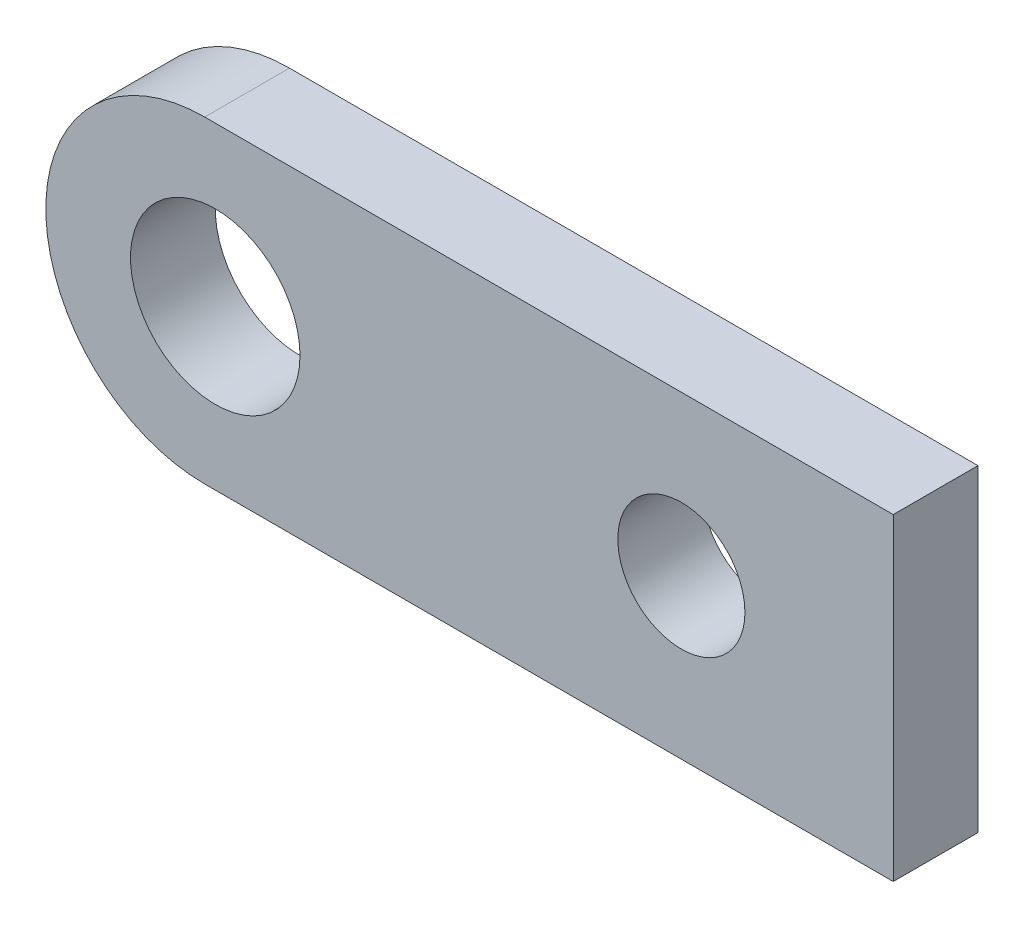
ISO-10303-21;
HEADER;
FILE_DESCRIPTION(('STEP AP214'),'2;1');
FILE_NAME('part.step','',(''),(''),'','','');
FILE_SCHEMA(('AUTOMOTIVE_DESIGN { 1 0 10303 214 1 1 1 1 }'));
ENDSEC;
DATA;
#1=APPLICATION_CONTEXT('core data for automotive mechanical design processes');
#2=APPLICATION_PROTOCOL_DEFINITION('international standard','automotive_design',2000,#1);
#3=PRODUCT_CONTEXT('',#1,'mechanical');
#4=PRODUCT('Part','Part','',(#3));
#5=PRODUCT_RELATED_PRODUCT_CATEGORY('part','',(#4));
#6=PRODUCT_DEFINITION_FORMATION('','',#4);
#7=PRODUCT_DEFINITION_CONTEXT('part definition',#1,'design');
#8=PRODUCT_DEFINITION('design','',#6,#7);
#9=PRODUCT_DEFINITION_SHAPE('','',#8);
#10=(LENGTH_UNIT() NAMED_UNIT(*) SI_UNIT(.MILLI.,.METRE.));
#11=(NAMED_UNIT(*) PLANE_ANGLE_UNIT() SI_UNIT($,.RADIAN.));
#12=(NAMED_UNIT(*) SI_UNIT($,.STERADIAN.) SOLID_ANGLE_UNIT());
#13=UNCERTAINTY_MEASURE_WITH_UNIT(LENGTH_MEASURE(1.E-05),#10,'distance_accuracy_value','');
#14=(GEOMETRIC_REPRESENTATION_CONTEXT(3) GLOBAL_UNCERTAINTY_ASSIGNED_CONTEXT((#13)) GLOBAL_UNIT_ASSIGNED_CONTEXT((#10,
#11,#12)) REPRESENTATION_CONTEXT('',''));
#15=CARTESIAN_POINT('',(0.,0.,0.));
#16=DIRECTION('',(0.,0.,1.));
#17=DIRECTION('',(1.,0.,0.));
#18=AXIS2_PLACEMENT_3D('',#15,#16,#17);
#19=CARTESIAN_POINT('',(7.50324567468238,7.5,4.));
#20=DIRECTION('',(0.,0.,1.));
#21=DIRECTION('',(1.,0.,0.));
#22=AXIS2_PLACEMENT_3D('',#19,#20,#21);
#23=PLANE('',#22);
#24=CARTESIAN_POINT('',(8.,7.5,4.));
#25=DIRECTION('',(0.,0.,1.));
#26=DIRECTION('',(1.,0.,0.));
#27=AXIS2_PLACEMENT_3D('',#24,#25,#26);
#28=CIRCLE('',#27,4.);
#29=CARTESIAN_POINT('',(12.,7.5,4.));
#30=VERTEX_POINT('',#29);
#31=EDGE_CURVE('E102',#30,#30,#28,.T.);
#32=ORIENTED_EDGE('',*,*,#31,.F.);
#33=EDGE_LOOP('',(#32));
#34=FACE_BOUND('',#33,.T.);
#35=DIRECTION('',(0.,1.,0.));
#36=VECTOR('',#35,1.);
#37=CARTESIAN_POINT('',(40.,0.,4.));
#38=LINE('',#37,#36);
#39=CARTESIAN_POINT('',(40.,0.,4.));
#40=VERTEX_POINT('',#39);
#41=CARTESIAN_POINT('',(40.,15.,4.));
#42=VERTEX_POINT('',#41);
#43=EDGE_CURVE('E87',#40,#42,#38,.T.);
#44=ORIENTED_EDGE('',*,*,#43,.T.);
#45=DIRECTION('',(-1.,0.,0.));
#46=VECTOR('',#45,1.);
#47=CARTESIAN_POINT('',(7.50324567468238,15.,4.));
#48=LINE('',#47,#46);
#49=CARTESIAN_POINT('',(7.50324567468238,15.,4.));
#50=VERTEX_POINT('',#49);
#51=EDGE_CURVE('E82',#42,#50,#48,.T.);
#52=ORIENTED_EDGE('',*,*,#51,.T.);
#53=CARTESIAN_POINT('',(7.50324567468238,7.5,4.));
#54=DIRECTION('',(0.,0.,1.));
#55=DIRECTION('',(1.,0.,0.));
#56=AXIS2_PLACEMENT_3D('',#53,#54,#55);
#57=CIRCLE('',#56,7.5);
#58=CARTESIAN_POINT('',(7.50324567468238,0.,4.));
#59=VERTEX_POINT('',#58);
#60=EDGE_CURVE('E85',#50,#59,#57,.T.);
#61=ORIENTED_EDGE('',*,*,#60,.T.);
#62=DIRECTION('',(1.,0.,0.));
#63=VECTOR('',#62,1.);
#64=CARTESIAN_POINT('',(7.50324567468238,0.,4.));
#65=LINE('',#64,#63);
#66=EDGE_CURVE('E52',#59,#40,#65,.T.);
#67=ORIENTED_EDGE('',*,*,#66,.T.);
#68=EDGE_LOOP('',(#44,#52,#61,#67));
#69=FACE_BOUND('',#68,.T.);
#70=CARTESIAN_POINT('',(30.,7.5,4.));
#71=DIRECTION('',(0.,0.,1.));
#72=DIRECTION('',(1.,0.,0.));
#73=AXIS2_PLACEMENT_3D('',#70,#71,#72);
#74=CIRCLE('',#73,3.);
#75=CARTESIAN_POINT('',(33.,7.5,4.));
#76=VERTEX_POINT('',#75);
#77=EDGE_CURVE('E117',#76,#76,#74,.T.);
#78=ORIENTED_EDGE('',*,*,#77,.F.);
#79=EDGE_LOOP('',(#78));
#80=FACE_BOUND('',#79,.T.);
#81=ADVANCED_FACE('F35',(#34,#69,#80),#23,.T.);
#82=CARTESIAN_POINT('',(7.50324567468238,7.5,0.));
#83=DIRECTION('',(0.,0.,1.));
#84=DIRECTION('',(1.,0.,0.));
#85=AXIS2_PLACEMENT_3D('',#82,#83,#84);
#86=PLANE('',#85);
#87=DIRECTION('',(0.,1.,0.));
#88=VECTOR('',#87,1.);
#89=CARTESIAN_POINT('',(40.,0.,0.));
#90=LINE('',#89,#88);
#91=CARTESIAN_POINT('',(40.,0.,0.));
#92=VERTEX_POINT('',#91);
#93=CARTESIAN_POINT('',(40.,15.,0.));
#94=VERTEX_POINT('',#93);
#95=EDGE_CURVE('E99',#92,#94,#90,.T.);
#96=ORIENTED_EDGE('',*,*,#95,.F.);
#97=DIRECTION('',(1.,0.,0.));
#98=VECTOR('',#97,1.);
#99=CARTESIAN_POINT('',(7.50324567468238,0.,0.));
#100=LINE('',#99,#98);
#101=CARTESIAN_POINT('',(7.50324567468238,0.,0.));
#102=VERTEX_POINT('',#101);
#103=EDGE_CURVE('E75',#102,#92,#100,.T.);
#104=ORIENTED_EDGE('',*,*,#103,.F.);
#105=CARTESIAN_POINT('',(7.50324567468238,7.5,0.));
#106=DIRECTION('',(0.,0.,1.));
#107=DIRECTION('',(1.,0.,0.));
#108=AXIS2_PLACEMENT_3D('',#105,#106,#107);
#109=CIRCLE('',#108,7.5);
#110=CARTESIAN_POINT('',(7.50324567468238,15.,0.));
#111=VERTEX_POINT('',#110);
#112=EDGE_CURVE('E69',#111,#102,#109,.T.);
#113=ORIENTED_EDGE('',*,*,#112,.F.);
#114=DIRECTION('',(-1.,0.,0.));
#115=VECTOR('',#114,1.);
#116=CARTESIAN_POINT('',(7.50324567468238,15.,0.));
#117=LINE('',#116,#115);
#118=EDGE_CURVE('E91',#94,#111,#117,.T.);
#119=ORIENTED_EDGE('',*,*,#118,.F.);
#120=EDGE_LOOP('',(#96,#104,#113,#119));
#121=FACE_BOUND('',#120,.T.);
#122=CARTESIAN_POINT('',(8.,7.5,0.));
#123=DIRECTION('',(0.,0.,1.));
#124=DIRECTION('',(1.,0.,0.));
#125=AXIS2_PLACEMENT_3D('',#122,#123,#124);
#126=CIRCLE('',#125,4.);
#127=CARTESIAN_POINT('',(12.,7.5,0.));
#128=VERTEX_POINT('',#127);
#129=EDGE_CURVE('E114',#128,#128,#126,.T.);
#130=ORIENTED_EDGE('',*,*,#129,.T.);
#131=EDGE_LOOP('',(#130));
#132=FACE_BOUND('',#131,.T.);
#133=CARTESIAN_POINT('',(30.,7.5,0.));
#134=DIRECTION('',(0.,0.,1.));
#135=DIRECTION('',(1.,0.,0.));
#136=AXIS2_PLACEMENT_3D('',#133,#134,#135);
#137=CIRCLE('',#136,3.);
#138=CARTESIAN_POINT('',(33.,7.5,0.));
#139=VERTEX_POINT('',#138);
#140=EDGE_CURVE('E120',#139,#139,#137,.T.);
#141=ORIENTED_EDGE('',*,*,#140,.T.);
#142=EDGE_LOOP('',(#141));
#143=FACE_BOUND('',#142,.T.);
#144=ADVANCED_FACE('F110',(#121,#132,#143),#86,.F.);
#145=CARTESIAN_POINT('',(40.,0.,4.));
#146=DIRECTION('',(-1.,0.,0.));
#147=DIRECTION('',(0.,0.,1.));
#148=AXIS2_PLACEMENT_3D('',#145,#146,#147);
#149=PLANE('',#148);
#150=ORIENTED_EDGE('',*,*,#95,.T.);
#151=DIRECTION('',(0.,0.,-1.));
#152=VECTOR('',#151,1.);
#153=CARTESIAN_POINT('',(40.,15.,4.));
#154=LINE('',#153,#152);
#155=EDGE_CURVE('E11',#42,#94,#154,.T.);
#156=ORIENTED_EDGE('',*,*,#155,.F.);
#157=ORIENTED_EDGE('',*,*,#43,.F.);
#158=DIRECTION('',(0.,0.,-1.));
#159=VECTOR('',#158,1.);
#160=CARTESIAN_POINT('',(40.,0.,4.));
#161=LINE('',#160,#159);
#162=EDGE_CURVE('E95',#40,#92,#161,.T.);
#163=ORIENTED_EDGE('',*,*,#162,.T.);
#164=EDGE_LOOP('',(#150,#156,#157,#163));
#165=FACE_BOUND('',#164,.T.);
#166=ADVANCED_FACE('F37',(#165),#149,.F.);
#167=CARTESIAN_POINT('',(7.50324567468238,15.,4.));
#168=DIRECTION('',(0.,-1.,0.));
#169=DIRECTION('',(0.,0.,-1.));
#170=AXIS2_PLACEMENT_3D('',#167,#168,#169);
#171=PLANE('',#170);
#172=ORIENTED_EDGE('',*,*,#118,.T.);
#173=DIRECTION('',(0.,0.,-1.));
#174=VECTOR('',#173,1.);
#175=CARTESIAN_POINT('',(7.50324567468238,15.,4.));
#176=LINE('',#175,#174);
#177=EDGE_CURVE('E44',#50,#111,#176,.T.);
#178=ORIENTED_EDGE('',*,*,#177,.F.);
#179=ORIENTED_EDGE('',*,*,#51,.F.);
#180=ORIENTED_EDGE('',*,*,#155,.T.);
#181=EDGE_LOOP('',(#172,#178,#179,#180));
#182=FACE_BOUND('',#181,.T.);
#183=ADVANCED_FACE('F90',(#182),#171,.F.);
#184=CARTESIAN_POINT('',(7.50324567468238,7.5,4.));
#185=DIRECTION('',(0.,0.,-1.));
#186=DIRECTION('',(-1.,0.,0.));
#187=AXIS2_PLACEMENT_3D('',#184,#185,#186);
#188=CYLINDRICAL_SURFACE('',#187,7.5);
#189=ORIENTED_EDGE('',*,*,#112,.T.);
#190=DIRECTION('',(0.,0.,-1.));
#191=VECTOR('',#190,1.);
#192=CARTESIAN_POINT('',(7.50324567468238,0.,4.));
#193=LINE('',#192,#191);
#194=EDGE_CURVE('E92',#59,#102,#193,.T.);
#195=ORIENTED_EDGE('',*,*,#194,.F.);
#196=ORIENTED_EDGE('',*,*,#60,.F.);
#197=ORIENTED_EDGE('',*,*,#177,.T.);
#198=EDGE_LOOP('',(#189,#195,#196,#197));
#199=FACE_BOUND('',#198,.T.);
#200=ADVANCED_FACE('F93',(#199),#188,.T.);
#201=CARTESIAN_POINT('',(7.50324567468238,0.,4.));
#202=DIRECTION('',(0.,1.,0.));
#203=DIRECTION('',(0.,0.,1.));
#204=AXIS2_PLACEMENT_3D('',#201,#202,#203);
#205=PLANE('',#204);
#206=ORIENTED_EDGE('',*,*,#103,.T.);
#207=ORIENTED_EDGE('',*,*,#162,.F.);
#208=ORIENTED_EDGE('',*,*,#66,.F.);
#209=ORIENTED_EDGE('',*,*,#194,.T.);
#210=EDGE_LOOP('',(#206,#207,#208,#209));
#211=FACE_BOUND('',#210,.T.);
#212=ADVANCED_FACE('F107',(#211),#205,.F.);
#213=CARTESIAN_POINT('',(8.,7.5,4.));
#214=DIRECTION('',(0.,0.,-1.));
#215=DIRECTION('',(-1.,0.,0.));
#216=AXIS2_PLACEMENT_3D('',#213,#214,#215);
#217=CYLINDRICAL_SURFACE('',#216,4.);
#218=ORIENTED_EDGE('',*,*,#31,.T.);
#219=EDGE_LOOP('',(#218));
#220=FACE_BOUND('',#219,.T.);
#221=ORIENTED_EDGE('',*,*,#129,.F.);
#222=EDGE_LOOP('',(#221));
#223=FACE_BOUND('',#222,.T.);
#224=ADVANCED_FACE('F137',(#220,#223),#217,.F.);
#225=CARTESIAN_POINT('',(30.,7.5,4.));
#226=DIRECTION('',(0.,0.,-1.));
#227=DIRECTION('',(-1.,0.,0.));
#228=AXIS2_PLACEMENT_3D('',#225,#226,#227);
#229=CYLINDRICAL_SURFACE('',#228,3.);
#230=ORIENTED_EDGE('',*,*,#77,.T.);
#231=EDGE_LOOP('',(#230));
#232=FACE_BOUND('',#231,.T.);
#233=ORIENTED_EDGE('',*,*,#140,.F.);
#234=EDGE_LOOP('',(#233));
#235=FACE_BOUND('',#234,.T.);
#236=ADVANCED_FACE('F126',(#232,#235),#229,.F.);
#237=CLOSED_SHELL('',(#81,#144,#166,#183,#200,#212,#224,#236));
#238=MANIFOLD_SOLID_BREP('B2',#237);
#239=ADVANCED_BREP_SHAPE_REPRESENTATION('',(#18,#238),#14);
#240=SHAPE_DEFINITION_REPRESENTATION(#9,#239);
ENDSEC;
END-ISO-10303-21;
